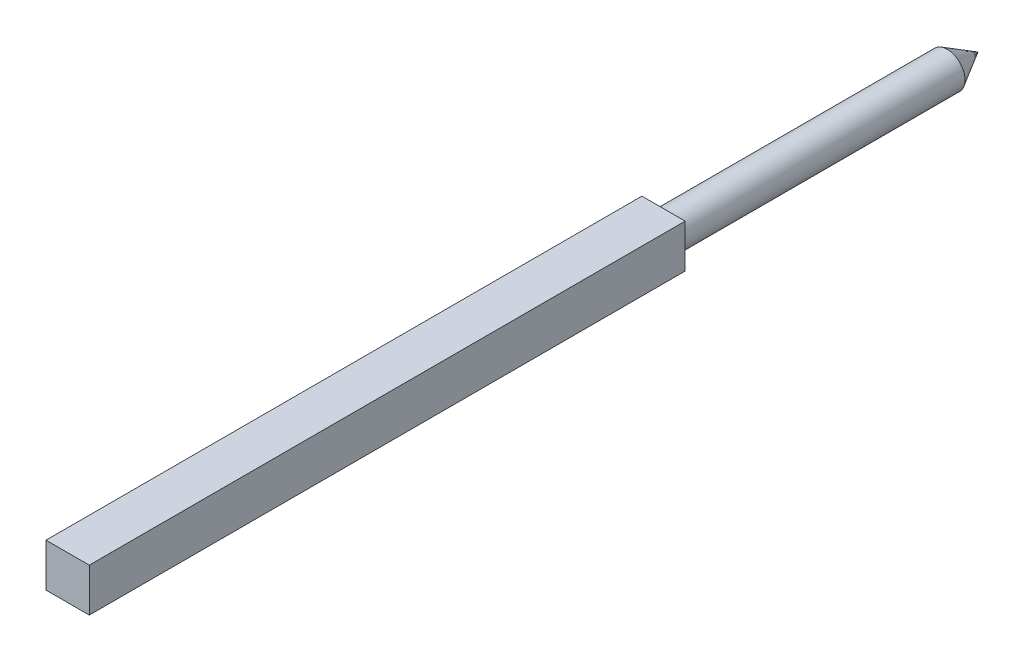
ISO-10303-21;
HEADER;
FILE_DESCRIPTION(('STEP AP214'),'2;1');
FILE_NAME('part.step','',(''),(''),'','','');
FILE_SCHEMA(('AUTOMOTIVE_DESIGN { 1 0 10303 214 1 1 1 1 }'));
ENDSEC;
DATA;
#1=APPLICATION_CONTEXT('core data for automotive mechanical design processes');
#2=APPLICATION_PROTOCOL_DEFINITION('international standard','automotive_design',2000,#1);
#3=PRODUCT_CONTEXT('',#1,'mechanical');
#4=PRODUCT('Part','Part','',(#3));
#5=PRODUCT_RELATED_PRODUCT_CATEGORY('part','',(#4));
#6=PRODUCT_DEFINITION_FORMATION('','',#4);
#7=PRODUCT_DEFINITION_CONTEXT('part definition',#1,'design');
#8=PRODUCT_DEFINITION('design','',#6,#7);
#9=PRODUCT_DEFINITION_SHAPE('','',#8);
#10=(LENGTH_UNIT() NAMED_UNIT(*) SI_UNIT(.MILLI.,.METRE.));
#11=(NAMED_UNIT(*) PLANE_ANGLE_UNIT() SI_UNIT($,.RADIAN.));
#12=(NAMED_UNIT(*) SI_UNIT($,.STERADIAN.) SOLID_ANGLE_UNIT());
#13=UNCERTAINTY_MEASURE_WITH_UNIT(LENGTH_MEASURE(1.E-05),#10,'distance_accuracy_value','');
#14=(GEOMETRIC_REPRESENTATION_CONTEXT(3) GLOBAL_UNCERTAINTY_ASSIGNED_CONTEXT((#13)) GLOBAL_UNIT_ASSIGNED_CONTEXT((#10,
#11,#12)) REPRESENTATION_CONTEXT('',''));
#15=CARTESIAN_POINT('',(0.,0.,0.));
#16=DIRECTION('',(0.,0.,1.));
#17=DIRECTION('',(1.,0.,0.));
#18=AXIS2_PLACEMENT_3D('',#15,#16,#17);
#19=CARTESIAN_POINT('',(-3.05,-3.05,84.));
#20=DIRECTION('',(0.,1.,0.));
#21=DIRECTION('',(0.,0.,1.));
#22=AXIS2_PLACEMENT_3D('',#19,#20,#21);
#23=PLANE('',#22);
#24=DIRECTION('',(1.,0.,0.));
#25=VECTOR('',#24,1.);
#26=CARTESIAN_POINT('',(-3.05,-3.05,0.));
#27=LINE('',#26,#25);
#28=CARTESIAN_POINT('',(-3.05,-3.05,0.));
#29=VERTEX_POINT('',#28);
#30=CARTESIAN_POINT('',(3.05,-3.05,0.));
#31=VERTEX_POINT('',#30);
#32=EDGE_CURVE('E96',#29,#31,#27,.T.);
#33=ORIENTED_EDGE('',*,*,#32,.T.);
#34=DIRECTION('',(0.,0.,-1.));
#35=VECTOR('',#34,1.);
#36=CARTESIAN_POINT('',(3.05,-3.05,84.));
#37=LINE('',#36,#35);
#38=CARTESIAN_POINT('',(3.05,-3.05,84.));
#39=VERTEX_POINT('',#38);
#40=EDGE_CURVE('E11',#39,#31,#37,.T.);
#41=ORIENTED_EDGE('',*,*,#40,.F.);
#42=DIRECTION('',(1.,0.,0.));
#43=VECTOR('',#42,1.);
#44=CARTESIAN_POINT('',(-3.05,-3.05,84.));
#45=LINE('',#44,#43);
#46=CARTESIAN_POINT('',(-3.05,-3.05,84.));
#47=VERTEX_POINT('',#46);
#48=EDGE_CURVE('E99',#47,#39,#45,.T.);
#49=ORIENTED_EDGE('',*,*,#48,.F.);
#50=DIRECTION('',(0.,0.,-1.));
#51=VECTOR('',#50,1.);
#52=CARTESIAN_POINT('',(-3.05,-3.05,84.));
#53=LINE('',#52,#51);
#54=EDGE_CURVE('E53',#47,#29,#53,.T.);
#55=ORIENTED_EDGE('',*,*,#54,.T.);
#56=EDGE_LOOP('',(#33,#41,#49,#55));
#57=FACE_BOUND('',#56,.T.);
#58=ADVANCED_FACE('F37',(#57),#23,.F.);
#59=CARTESIAN_POINT('',(3.05,-3.05,84.));
#60=DIRECTION('',(-1.,0.,0.));
#61=DIRECTION('',(0.,0.,1.));
#62=AXIS2_PLACEMENT_3D('',#59,#60,#61);
#63=PLANE('',#62);
#64=DIRECTION('',(0.,1.,0.));
#65=VECTOR('',#64,1.);
#66=CARTESIAN_POINT('',(3.05,-3.05,0.));
#67=LINE('',#66,#65);
#68=CARTESIAN_POINT('',(3.05,3.05,0.));
#69=VERTEX_POINT('',#68);
#70=EDGE_CURVE('E109',#31,#69,#67,.T.);
#71=ORIENTED_EDGE('',*,*,#70,.T.);
#72=DIRECTION('',(0.,0.,-1.));
#73=VECTOR('',#72,1.);
#74=CARTESIAN_POINT('',(3.05,3.05,84.));
#75=LINE('',#74,#73);
#76=CARTESIAN_POINT('',(3.05,3.05,84.));
#77=VERTEX_POINT('',#76);
#78=EDGE_CURVE('E45',#77,#69,#75,.T.);
#79=ORIENTED_EDGE('',*,*,#78,.F.);
#80=DIRECTION('',(0.,1.,0.));
#81=VECTOR('',#80,1.);
#82=CARTESIAN_POINT('',(3.05,-3.05,84.));
#83=LINE('',#82,#81);
#84=EDGE_CURVE('E79',#39,#77,#83,.T.);
#85=ORIENTED_EDGE('',*,*,#84,.F.);
#86=ORIENTED_EDGE('',*,*,#40,.T.);
#87=EDGE_LOOP('',(#71,#79,#85,#86));
#88=FACE_BOUND('',#87,.T.);
#89=ADVANCED_FACE('F121',(#88),#63,.F.);
#90=CARTESIAN_POINT('',(-3.05,3.05,84.));
#91=DIRECTION('',(0.,1.,0.));
#92=DIRECTION('',(0.,0.,1.));
#93=AXIS2_PLACEMENT_3D('',#90,#91,#92);
#94=PLANE('',#93);
#95=DIRECTION('',(1.,0.,0.));
#96=VECTOR('',#95,1.);
#97=CARTESIAN_POINT('',(-3.05,3.05,0.));
#98=LINE('',#97,#96);
#99=CARTESIAN_POINT('',(-3.05,3.05,0.));
#100=VERTEX_POINT('',#99);
#101=EDGE_CURVE('E112',#100,#69,#98,.T.);
#102=ORIENTED_EDGE('',*,*,#101,.F.);
#103=DIRECTION('',(0.,0.,-1.));
#104=VECTOR('',#103,1.);
#105=CARTESIAN_POINT('',(-3.05,3.05,84.));
#106=LINE('',#105,#104);
#107=CARTESIAN_POINT('',(-3.05,3.05,84.));
#108=VERTEX_POINT('',#107);
#109=EDGE_CURVE('E68',#108,#100,#106,.T.);
#110=ORIENTED_EDGE('',*,*,#109,.F.);
#111=DIRECTION('',(1.,0.,0.));
#112=VECTOR('',#111,1.);
#113=CARTESIAN_POINT('',(-3.05,3.05,84.));
#114=LINE('',#113,#112);
#115=EDGE_CURVE('E103',#108,#77,#114,.T.);
#116=ORIENTED_EDGE('',*,*,#115,.T.);
#117=ORIENTED_EDGE('',*,*,#78,.T.);
#118=EDGE_LOOP('',(#102,#110,#116,#117));
#119=FACE_BOUND('',#118,.T.);
#120=ADVANCED_FACE('F119',(#119),#94,.T.);
#121=CARTESIAN_POINT('',(-3.05,-3.05,84.));
#122=DIRECTION('',(-1.,0.,0.));
#123=DIRECTION('',(0.,0.,1.));
#124=AXIS2_PLACEMENT_3D('',#121,#122,#123);
#125=PLANE('',#124);
#126=DIRECTION('',(0.,1.,0.));
#127=VECTOR('',#126,1.);
#128=CARTESIAN_POINT('',(-3.05,-3.05,0.));
#129=LINE('',#128,#127);
#130=EDGE_CURVE('E101',#29,#100,#129,.T.);
#131=ORIENTED_EDGE('',*,*,#130,.F.);
#132=ORIENTED_EDGE('',*,*,#54,.F.);
#133=DIRECTION('',(0.,1.,0.));
#134=VECTOR('',#133,1.);
#135=CARTESIAN_POINT('',(-3.05,-3.05,84.));
#136=LINE('',#135,#134);
#137=EDGE_CURVE('E106',#47,#108,#136,.T.);
#138=ORIENTED_EDGE('',*,*,#137,.T.);
#139=ORIENTED_EDGE('',*,*,#109,.T.);
#140=EDGE_LOOP('',(#131,#132,#138,#139));
#141=FACE_BOUND('',#140,.T.);
#142=ADVANCED_FACE('F125',(#141),#125,.T.);
#143=CARTESIAN_POINT('',(0.,0.,84.));
#144=DIRECTION('',(0.,0.,1.));
#145=DIRECTION('',(1.,0.,0.));
#146=AXIS2_PLACEMENT_3D('',#143,#144,#145);
#147=PLANE('',#146);
#148=ORIENTED_EDGE('',*,*,#48,.T.);
#149=ORIENTED_EDGE('',*,*,#84,.T.);
#150=ORIENTED_EDGE('',*,*,#115,.F.);
#151=ORIENTED_EDGE('',*,*,#137,.F.);
#152=EDGE_LOOP('',(#148,#149,#150,#151));
#153=FACE_BOUND('',#152,.T.);
#154=ADVANCED_FACE('F127',(#153),#147,.T.);
#155=CARTESIAN_POINT('',(0.,0.,0.));
#156=DIRECTION('',(0.,0.,1.));
#157=DIRECTION('',(1.,0.,0.));
#158=AXIS2_PLACEMENT_3D('',#155,#156,#157);
#159=PLANE('',#158);
#160=CARTESIAN_POINT('',(0.,0.,0.));
#161=DIRECTION('',(0.,0.,1.));
#162=DIRECTION('',(1.,0.,0.));
#163=AXIS2_PLACEMENT_3D('',#160,#161,#162);
#164=CIRCLE('',#163,2.5);
#165=CARTESIAN_POINT('',(2.5,0.,0.));
#166=VERTEX_POINT('',#165);
#167=EDGE_CURVE('E93',#166,#166,#164,.T.);
#168=ORIENTED_EDGE('',*,*,#167,.T.);
#169=EDGE_LOOP('',(#168));
#170=FACE_BOUND('',#169,.T.);
#171=ORIENTED_EDGE('',*,*,#32,.F.);
#172=ORIENTED_EDGE('',*,*,#130,.T.);
#173=ORIENTED_EDGE('',*,*,#101,.T.);
#174=ORIENTED_EDGE('',*,*,#70,.F.);
#175=EDGE_LOOP('',(#171,#172,#173,#174));
#176=FACE_BOUND('',#175,.T.);
#177=ADVANCED_FACE('F124',(#170,#176),#159,.F.);
#178=CARTESIAN_POINT('',(0.,0.,-40.));
#179=DIRECTION('',(0.,0.,1.));
#180=DIRECTION('',(1.,0.,0.));
#181=AXIS2_PLACEMENT_3D('',#178,#179,#180);
#182=CYLINDRICAL_SURFACE('',#181,2.5);
#183=CARTESIAN_POINT('',(0.,0.,-40.));
#184=DIRECTION('',(0.,0.,-1.));
#185=DIRECTION('',(-1.,0.,0.));
#186=AXIS2_PLACEMENT_3D('',#183,#184,#185);
#187=CIRCLE('',#186,2.5);
#188=CARTESIAN_POINT('',(-2.5,0.,-40.));
#189=VERTEX_POINT('',#188);
#190=EDGE_CURVE('E91',#189,#189,#187,.T.);
#191=ORIENTED_EDGE('',*,*,#190,.F.);
#192=EDGE_LOOP('',(#191));
#193=FACE_BOUND('',#192,.T.);
#194=ORIENTED_EDGE('',*,*,#167,.F.);
#195=EDGE_LOOP('',(#194));
#196=FACE_BOUND('',#195,.T.);
#197=ADVANCED_FACE('F87',(#193,#196),#182,.T.);
#198=CARTESIAN_POINT('',(0.,0.,-40.));
#199=DIRECTION('',(0.,0.,1.));
#200=DIRECTION('',(-1.,0.,0.));
#201=AXIS2_PLACEMENT_3D('',#198,#199,#200);
#202=CONICAL_SURFACE('',#201,2.5,0.5235987755983);
#203=CARTESIAN_POINT('',(0.,0.,-44.3301270189222));
#204=VERTEX_POINT('',#203);
#205=VERTEX_LOOP('',#204);
#206=FACE_BOUND('',#205,.T.);
#207=ORIENTED_EDGE('',*,*,#190,.T.);
#208=EDGE_LOOP('',(#207));
#209=FACE_BOUND('',#208,.T.);
#210=ADVANCED_FACE('F84',(#206,#209),#202,.T.);
#211=CLOSED_SHELL('',(#58,#89,#120,#142,#154,#177,#197,#210));
#212=MANIFOLD_SOLID_BREP('B2',#211);
#213=ADVANCED_BREP_SHAPE_REPRESENTATION('',(#18,#212),#14);
#214=SHAPE_DEFINITION_REPRESENTATION(#9,#213);
ENDSEC;
END-ISO-10303-21;
